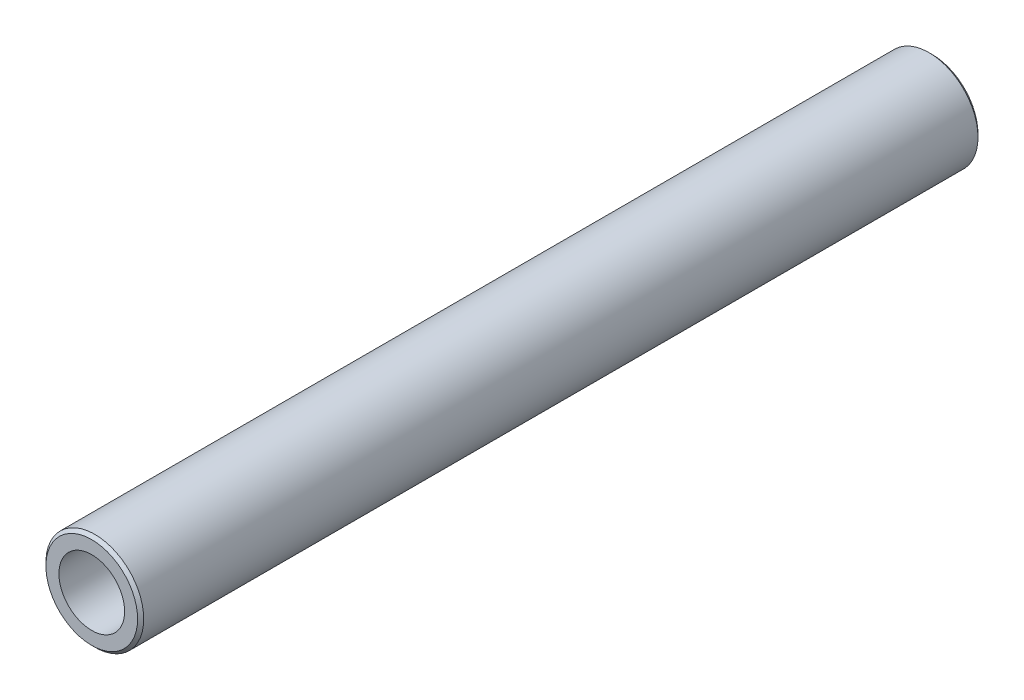
ISO-10303-21;
HEADER;
FILE_DESCRIPTION(('STEP AP214'),'2;1');
FILE_NAME('part.step','',(''),(''),'','','');
FILE_SCHEMA(('AUTOMOTIVE_DESIGN { 1 0 10303 214 1 1 1 1 }'));
ENDSEC;
DATA;
#1=APPLICATION_CONTEXT('core data for automotive mechanical design processes');
#2=APPLICATION_PROTOCOL_DEFINITION('international standard','automotive_design',2000,#1);
#3=PRODUCT_CONTEXT('',#1,'mechanical');
#4=PRODUCT('Part','Part','',(#3));
#5=PRODUCT_RELATED_PRODUCT_CATEGORY('part','',(#4));
#6=PRODUCT_DEFINITION_FORMATION('','',#4);
#7=PRODUCT_DEFINITION_CONTEXT('part definition',#1,'design');
#8=PRODUCT_DEFINITION('design','',#6,#7);
#9=PRODUCT_DEFINITION_SHAPE('','',#8);
#10=(LENGTH_UNIT() NAMED_UNIT(*) SI_UNIT(.MILLI.,.METRE.));
#11=(NAMED_UNIT(*) PLANE_ANGLE_UNIT() SI_UNIT($,.RADIAN.));
#12=(NAMED_UNIT(*) SI_UNIT($,.STERADIAN.) SOLID_ANGLE_UNIT());
#13=UNCERTAINTY_MEASURE_WITH_UNIT(LENGTH_MEASURE(1.E-05),#10,'distance_accuracy_value','');
#14=(GEOMETRIC_REPRESENTATION_CONTEXT(3) GLOBAL_UNCERTAINTY_ASSIGNED_CONTEXT((#13)) GLOBAL_UNIT_ASSIGNED_CONTEXT((#10,
#11,#12)) REPRESENTATION_CONTEXT('',''));
#15=CARTESIAN_POINT('',(0.,0.,0.));
#16=DIRECTION('',(0.,0.,1.));
#17=DIRECTION('',(1.,0.,0.));
#18=AXIS2_PLACEMENT_3D('',#15,#16,#17);
#19=CARTESIAN_POINT('',(0.,0.,110.));
#20=DIRECTION('',(0.,0.,1.));
#21=DIRECTION('',(1.,0.,0.));
#22=AXIS2_PLACEMENT_3D('',#19,#20,#21);
#23=PLANE('',#22);
#24=CARTESIAN_POINT('',(0.,0.,110.));
#25=DIRECTION('',(0.,0.,1.));
#26=DIRECTION('',(1.,0.,0.));
#27=AXIS2_PLACEMENT_3D('',#24,#25,#26);
#28=CIRCLE('',#27,6.00000000000002);
#29=CARTESIAN_POINT('',(6.00000000000002,0.,110.));
#30=VERTEX_POINT('',#29);
#31=EDGE_CURVE('E45',#30,#30,#28,.T.);
#32=ORIENTED_EDGE('',*,*,#31,.T.);
#33=EDGE_LOOP('',(#32));
#34=FACE_BOUND('',#33,.T.);
#35=CARTESIAN_POINT('',(0.,0.,110.));
#36=DIRECTION('',(0.,0.,1.));
#37=DIRECTION('',(1.,0.,0.));
#38=AXIS2_PLACEMENT_3D('',#35,#36,#37);
#39=CIRCLE('',#38,4.3);
#40=CARTESIAN_POINT('',(4.3,0.,110.));
#41=VERTEX_POINT('',#40);
#42=EDGE_CURVE('E50',#41,#41,#39,.T.);
#43=ORIENTED_EDGE('',*,*,#42,.F.);
#44=EDGE_LOOP('',(#43));
#45=FACE_BOUND('',#44,.T.);
#46=ADVANCED_FACE('F30',(#34,#45),#23,.T.);
#47=CARTESIAN_POINT('',(0.,0.,0.));
#48=DIRECTION('',(0.,0.,1.));
#49=DIRECTION('',(1.,0.,0.));
#50=AXIS2_PLACEMENT_3D('',#47,#48,#49);
#51=PLANE('',#50);
#52=CARTESIAN_POINT('',(0.,0.,0.));
#53=DIRECTION('',(0.,0.,1.));
#54=DIRECTION('',(1.,0.,0.));
#55=AXIS2_PLACEMENT_3D('',#52,#53,#54);
#56=CIRCLE('',#55,6.00000000000001);
#57=CARTESIAN_POINT('',(6.00000000000001,0.,0.));
#58=VERTEX_POINT('',#57);
#59=EDGE_CURVE('E10',#58,#58,#56,.F.);
#60=ORIENTED_EDGE('',*,*,#59,.T.);
#61=EDGE_LOOP('',(#60));
#62=FACE_BOUND('',#61,.T.);
#63=CARTESIAN_POINT('',(0.,0.,0.));
#64=DIRECTION('',(0.,0.,1.));
#65=DIRECTION('',(1.,0.,0.));
#66=AXIS2_PLACEMENT_3D('',#63,#64,#65);
#67=CIRCLE('',#66,4.3);
#68=CARTESIAN_POINT('',(4.3,0.,0.));
#69=VERTEX_POINT('',#68);
#70=EDGE_CURVE('E51',#69,#69,#67,.T.);
#71=ORIENTED_EDGE('',*,*,#70,.T.);
#72=EDGE_LOOP('',(#71));
#73=FACE_BOUND('',#72,.T.);
#74=ADVANCED_FACE('F61',(#62,#73),#51,.F.);
#75=CARTESIAN_POINT('',(0.,0.,110.));
#76=DIRECTION('',(0.,0.,-1.));
#77=DIRECTION('',(-1.,0.,0.));
#78=AXIS2_PLACEMENT_3D('',#75,#76,#77);
#79=CYLINDRICAL_SURFACE('',#78,6.4);
#80=CARTESIAN_POINT('',(0.,0.,109.6));
#81=DIRECTION('',(0.,0.,1.));
#82=DIRECTION('',(1.,0.,0.));
#83=AXIS2_PLACEMENT_3D('',#80,#81,#82);
#84=CIRCLE('',#83,6.4);
#85=CARTESIAN_POINT('',(6.4,0.,109.6));
#86=VERTEX_POINT('',#85);
#87=EDGE_CURVE('E37',#86,#86,#84,.F.);
#88=ORIENTED_EDGE('',*,*,#87,.T.);
#89=EDGE_LOOP('',(#88));
#90=FACE_BOUND('',#89,.T.);
#91=CARTESIAN_POINT('',(0.,0.,0.399999999999998));
#92=DIRECTION('',(0.,0.,1.));
#93=DIRECTION('',(1.,0.,0.));
#94=AXIS2_PLACEMENT_3D('',#91,#92,#93);
#95=CIRCLE('',#94,6.4);
#96=CARTESIAN_POINT('',(6.4,0.,0.399999999999998));
#97=VERTEX_POINT('',#96);
#98=EDGE_CURVE('E41',#97,#97,#95,.T.);
#99=ORIENTED_EDGE('',*,*,#98,.T.);
#100=EDGE_LOOP('',(#99));
#101=FACE_BOUND('',#100,.T.);
#102=ADVANCED_FACE('F67',(#90,#101),#79,.T.);
#103=CARTESIAN_POINT('',(0.,0.,110.));
#104=DIRECTION('',(0.,0.,-1.));
#105=DIRECTION('',(-1.,0.,0.));
#106=AXIS2_PLACEMENT_3D('',#103,#104,#105);
#107=CYLINDRICAL_SURFACE('',#106,4.3);
#108=ORIENTED_EDGE('',*,*,#42,.T.);
#109=EDGE_LOOP('',(#108));
#110=FACE_BOUND('',#109,.T.);
#111=ORIENTED_EDGE('',*,*,#70,.F.);
#112=EDGE_LOOP('',(#111));
#113=FACE_BOUND('',#112,.T.);
#114=ADVANCED_FACE('F57',(#110,#113),#107,.F.);
#115=CARTESIAN_POINT('',(0.,0.,110.));
#116=DIRECTION('',(0.,0.,-1.));
#117=DIRECTION('',(-1.,0.,0.));
#118=AXIS2_PLACEMENT_3D('',#115,#116,#117);
#119=CONICAL_SURFACE('',#118,6.00000000000002,0.785398163397445);
#120=ORIENTED_EDGE('',*,*,#87,.F.);
#121=EDGE_LOOP('',(#120));
#122=FACE_BOUND('',#121,.T.);
#123=ORIENTED_EDGE('',*,*,#31,.F.);
#124=EDGE_LOOP('',(#123));
#125=FACE_BOUND('',#124,.T.);
#126=ADVANCED_FACE('F72',(#122,#125),#119,.T.);
#127=CARTESIAN_POINT('',(0.,0.,0.399999999999998));
#128=DIRECTION('',(0.,0.,1.));
#129=DIRECTION('',(1.,0.,0.));
#130=AXIS2_PLACEMENT_3D('',#127,#128,#129);
#131=CONICAL_SURFACE('',#130,6.4,0.785398163397445);
#132=ORIENTED_EDGE('',*,*,#59,.F.);
#133=EDGE_LOOP('',(#132));
#134=FACE_BOUND('',#133,.T.);
#135=ORIENTED_EDGE('',*,*,#98,.F.);
#136=EDGE_LOOP('',(#135));
#137=FACE_BOUND('',#136,.T.);
#138=ADVANCED_FACE('F32',(#134,#137),#131,.T.);
#139=CLOSED_SHELL('',(#46,#74,#102,#114,#126,#138));
#140=MANIFOLD_SOLID_BREP('B2',#139);
#141=ADVANCED_BREP_SHAPE_REPRESENTATION('',(#18,#140),#14);
#142=SHAPE_DEFINITION_REPRESENTATION(#9,#141);
ENDSEC;
END-ISO-10303-21;
